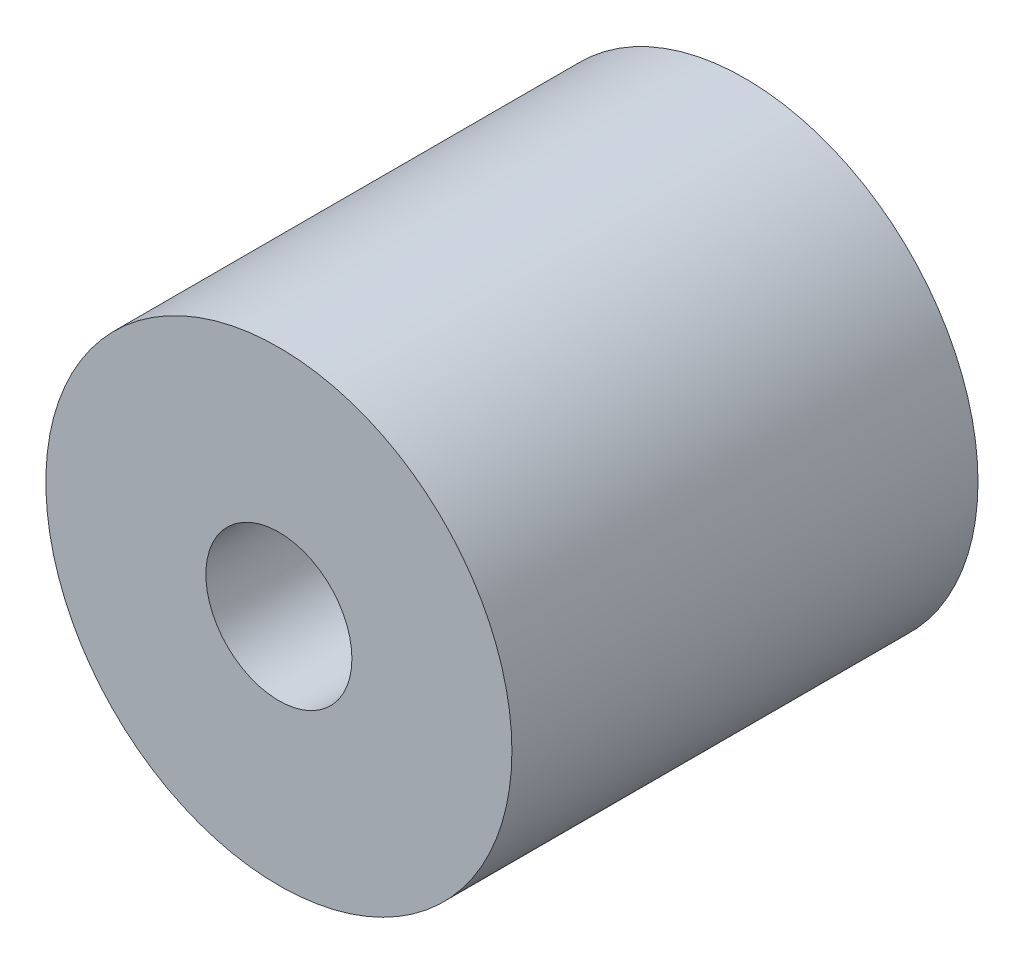
ISO-10303-21;
HEADER;
FILE_DESCRIPTION(('STEP AP214'),'2;1');
FILE_NAME('part.step','',(''),(''),'','','');
FILE_SCHEMA(('AUTOMOTIVE_DESIGN { 1 0 10303 214 1 1 1 1 }'));
ENDSEC;
DATA;
#1=APPLICATION_CONTEXT('core data for automotive mechanical design processes');
#2=APPLICATION_PROTOCOL_DEFINITION('international standard','automotive_design',2000,#1);
#3=PRODUCT_CONTEXT('',#1,'mechanical');
#4=PRODUCT('Part','Part','',(#3));
#5=PRODUCT_RELATED_PRODUCT_CATEGORY('part','',(#4));
#6=PRODUCT_DEFINITION_FORMATION('','',#4);
#7=PRODUCT_DEFINITION_CONTEXT('part definition',#1,'design');
#8=PRODUCT_DEFINITION('design','',#6,#7);
#9=PRODUCT_DEFINITION_SHAPE('','',#8);
#10=(LENGTH_UNIT() NAMED_UNIT(*) SI_UNIT(.MILLI.,.METRE.));
#11=(NAMED_UNIT(*) PLANE_ANGLE_UNIT() SI_UNIT($,.RADIAN.));
#12=(NAMED_UNIT(*) SI_UNIT($,.STERADIAN.) SOLID_ANGLE_UNIT());
#13=UNCERTAINTY_MEASURE_WITH_UNIT(LENGTH_MEASURE(1.E-05),#10,'distance_accuracy_value','');
#14=(GEOMETRIC_REPRESENTATION_CONTEXT(3) GLOBAL_UNCERTAINTY_ASSIGNED_CONTEXT((#13)) GLOBAL_UNIT_ASSIGNED_CONTEXT((#10,
#11,#12)) REPRESENTATION_CONTEXT('',''));
#15=CARTESIAN_POINT('',(0.,0.,0.));
#16=DIRECTION('',(0.,0.,1.));
#17=DIRECTION('',(1.,0.,0.));
#18=AXIS2_PLACEMENT_3D('',#15,#16,#17);
#19=CARTESIAN_POINT('',(0.,0.,15.));
#20=DIRECTION('',(0.,0.,-1.));
#21=DIRECTION('',(-1.,0.,0.));
#22=AXIS2_PLACEMENT_3D('',#19,#20,#21);
#23=CYLINDRICAL_SURFACE('',#22,2.5);
#24=CARTESIAN_POINT('',(0.,0.,6.));
#25=DIRECTION('',(0.,0.,-1.));
#26=DIRECTION('',(-1.,0.,0.));
#27=AXIS2_PLACEMENT_3D('',#24,#25,#26);
#28=CIRCLE('',#27,2.5);
#29=CARTESIAN_POINT('',(2.,-1.5,6.));
#30=VERTEX_POINT('',#29);
#31=CARTESIAN_POINT('',(2.,1.5,6.));
#32=VERTEX_POINT('',#31);
#33=EDGE_CURVE('E152',#30,#32,#28,.F.);
#34=ORIENTED_EDGE('',*,*,#33,.T.);
#35=DIRECTION('',(0.,0.,-1.));
#36=VECTOR('',#35,1.);
#37=CARTESIAN_POINT('',(2.,1.5,6.));
#38=LINE('',#37,#36);
#39=CARTESIAN_POINT('',(2.,1.5,0.));
#40=VERTEX_POINT('',#39);
#41=EDGE_CURVE('E93',#32,#40,#38,.T.);
#42=ORIENTED_EDGE('',*,*,#41,.T.);
#43=CARTESIAN_POINT('',(0.,0.,0.));
#44=DIRECTION('',(0.,0.,1.));
#45=DIRECTION('',(1.,0.,0.));
#46=AXIS2_PLACEMENT_3D('',#43,#44,#45);
#47=CIRCLE('',#46,2.5);
#48=CARTESIAN_POINT('',(2.,-1.5,0.));
#49=VERTEX_POINT('',#48);
#50=EDGE_CURVE('E135',#49,#40,#47,.T.);
#51=ORIENTED_EDGE('',*,*,#50,.F.);
#52=DIRECTION('',(0.,0.,-1.));
#53=VECTOR('',#52,1.);
#54=CARTESIAN_POINT('',(2.,-1.5,6.));
#55=LINE('',#54,#53);
#56=EDGE_CURVE('E129',#30,#49,#55,.T.);
#57=ORIENTED_EDGE('',*,*,#56,.F.);
#58=EDGE_LOOP('',(#34,#42,#51,#57));
#59=FACE_BOUND('',#58,.T.);
#60=ADVANCED_FACE('F35',(#59),#23,.F.);
#61=CARTESIAN_POINT('',(0.,0.,6.));
#62=DIRECTION('',(0.,0.,-1.));
#63=DIRECTION('',(-1.,0.,0.));
#64=AXIS2_PLACEMENT_3D('',#61,#62,#63);
#65=PLANE('',#64);
#66=CARTESIAN_POINT('',(0.,0.,6.));
#67=DIRECTION('',(0.,0.,-1.));
#68=DIRECTION('',(-1.,0.,0.));
#69=AXIS2_PLACEMENT_3D('',#66,#67,#68);
#70=CIRCLE('',#69,2.35);
#71=CARTESIAN_POINT('',(-1.80900525151255,-1.5,6.));
#72=VERTEX_POINT('',#71);
#73=CARTESIAN_POINT('',(1.80900525151255,-1.5,6.));
#74=VERTEX_POINT('',#73);
#75=EDGE_CURVE('E49',#72,#74,#70,.F.);
#76=ORIENTED_EDGE('',*,*,#75,.T.);
#77=DIRECTION('',(1.,0.,0.));
#78=VECTOR('',#77,1.);
#79=CARTESIAN_POINT('',(2.,-1.5,6.));
#80=LINE('',#79,#78);
#81=EDGE_CURVE('E52',#72,#74,#80,.T.);
#82=ORIENTED_EDGE('',*,*,#81,.F.);
#83=EDGE_LOOP('',(#76,#82));
#84=FACE_BOUND('',#83,.T.);
#85=ADVANCED_FACE('F175',(#84),#65,.F.);
#86=CARTESIAN_POINT('',(0.,0.,6.));
#87=DIRECTION('',(0.,0.,-1.));
#88=DIRECTION('',(-1.,0.,0.));
#89=AXIS2_PLACEMENT_3D('',#86,#87,#88);
#90=PLANE('',#89);
#91=CARTESIAN_POINT('',(0.,0.,6.));
#92=DIRECTION('',(0.,0.,-1.));
#93=DIRECTION('',(-1.,0.,0.));
#94=AXIS2_PLACEMENT_3D('',#91,#92,#93);
#95=CIRCLE('',#94,2.35);
#96=CARTESIAN_POINT('',(-1.80900525151255,1.5,6.));
#97=VERTEX_POINT('',#96);
#98=CARTESIAN_POINT('',(1.80900525151255,1.5,6.));
#99=VERTEX_POINT('',#98);
#100=EDGE_CURVE('E11',#97,#99,#95,.T.);
#101=ORIENTED_EDGE('',*,*,#100,.F.);
#102=DIRECTION('',(-1.,0.,0.));
#103=VECTOR('',#102,1.);
#104=CARTESIAN_POINT('',(2.,1.5,6.));
#105=LINE('',#104,#103);
#106=EDGE_CURVE('E90',#99,#97,#105,.T.);
#107=ORIENTED_EDGE('',*,*,#106,.F.);
#108=EDGE_LOOP('',(#101,#107));
#109=FACE_BOUND('',#108,.T.);
#110=ADVANCED_FACE('F100',(#109),#90,.F.);
#111=CARTESIAN_POINT('',(0.,0.,15.));
#112=DIRECTION('',(0.,0.,1.));
#113=DIRECTION('',(1.,0.,0.));
#114=AXIS2_PLACEMENT_3D('',#111,#112,#113);
#115=PLANE('',#114);
#116=CARTESIAN_POINT('',(0.,0.,15.));
#117=DIRECTION('',(0.,0.,1.));
#118=DIRECTION('',(1.,0.,0.));
#119=AXIS2_PLACEMENT_3D('',#116,#117,#118);
#120=CIRCLE('',#119,7.5);
#121=CARTESIAN_POINT('',(7.5,0.,15.));
#122=VERTEX_POINT('',#121);
#123=EDGE_CURVE('E43',#122,#122,#120,.T.);
#124=ORIENTED_EDGE('',*,*,#123,.T.);
#125=EDGE_LOOP('',(#124));
#126=FACE_BOUND('',#125,.T.);
#127=CARTESIAN_POINT('',(0.,0.,15.));
#128=DIRECTION('',(0.,0.,1.));
#129=DIRECTION('',(1.,0.,0.));
#130=AXIS2_PLACEMENT_3D('',#127,#128,#129);
#131=CIRCLE('',#130,2.35);
#132=CARTESIAN_POINT('',(2.35,0.,15.));
#133=VERTEX_POINT('',#132);
#134=EDGE_CURVE('E112',#133,#133,#131,.T.);
#135=ORIENTED_EDGE('',*,*,#134,.F.);
#136=EDGE_LOOP('',(#135));
#137=FACE_BOUND('',#136,.T.);
#138=ADVANCED_FACE('F147',(#126,#137),#115,.T.);
#139=CARTESIAN_POINT('',(0.,0.,0.));
#140=DIRECTION('',(0.,0.,1.));
#141=DIRECTION('',(1.,0.,0.));
#142=AXIS2_PLACEMENT_3D('',#139,#140,#141);
#143=PLANE('',#142);
#144=CARTESIAN_POINT('',(0.,0.,0.));
#145=DIRECTION('',(0.,0.,1.));
#146=DIRECTION('',(1.,0.,0.));
#147=AXIS2_PLACEMENT_3D('',#144,#145,#146);
#148=CIRCLE('',#147,7.5);
#149=CARTESIAN_POINT('',(7.5,0.,0.));
#150=VERTEX_POINT('',#149);
#151=EDGE_CURVE('E138',#150,#150,#148,.T.);
#152=ORIENTED_EDGE('',*,*,#151,.F.);
#153=EDGE_LOOP('',(#152));
#154=FACE_BOUND('',#153,.T.);
#155=ORIENTED_EDGE('',*,*,#50,.T.);
#156=DIRECTION('',(-1.,0.,0.));
#157=VECTOR('',#156,1.);
#158=CARTESIAN_POINT('',(2.,1.5,0.));
#159=LINE('',#158,#157);
#160=CARTESIAN_POINT('',(-2.,1.5,0.));
#161=VERTEX_POINT('',#160);
#162=EDGE_CURVE('E117',#40,#161,#159,.T.);
#163=ORIENTED_EDGE('',*,*,#162,.T.);
#164=CARTESIAN_POINT('',(-2.,-1.5,0.));
#165=VERTEX_POINT('',#164);
#166=EDGE_CURVE('E132',#161,#165,#47,.T.);
#167=ORIENTED_EDGE('',*,*,#166,.T.);
#168=DIRECTION('',(1.,0.,0.));
#169=VECTOR('',#168,1.);
#170=CARTESIAN_POINT('',(2.,-1.5,0.));
#171=LINE('',#170,#169);
#172=EDGE_CURVE('E123',#165,#49,#171,.T.);
#173=ORIENTED_EDGE('',*,*,#172,.T.);
#174=EDGE_LOOP('',(#155,#163,#167,#173));
#175=FACE_BOUND('',#174,.T.);
#176=ADVANCED_FACE('F144',(#154,#175),#143,.F.);
#177=CARTESIAN_POINT('',(0.,0.,15.));
#178=DIRECTION('',(0.,0.,-1.));
#179=DIRECTION('',(-1.,0.,0.));
#180=AXIS2_PLACEMENT_3D('',#177,#178,#179);
#181=CYLINDRICAL_SURFACE('',#180,7.5);
#182=ORIENTED_EDGE('',*,*,#123,.F.);
#183=EDGE_LOOP('',(#182));
#184=FACE_BOUND('',#183,.T.);
#185=ORIENTED_EDGE('',*,*,#151,.T.);
#186=EDGE_LOOP('',(#185));
#187=FACE_BOUND('',#186,.T.);
#188=ADVANCED_FACE('F37',(#184,#187),#181,.T.);
#189=CARTESIAN_POINT('',(-2.,1.5,6.));
#190=VERTEX_POINT('',#189);
#191=CARTESIAN_POINT('',(-2.,-1.5,6.));
#192=VERTEX_POINT('',#191);
#193=EDGE_CURVE('E115',#190,#192,#28,.F.);
#194=ORIENTED_EDGE('',*,*,#193,.T.);
#195=DIRECTION('',(0.,0.,-1.));
#196=VECTOR('',#195,1.);
#197=CARTESIAN_POINT('',(-2.,-1.5,6.));
#198=LINE('',#197,#196);
#199=EDGE_CURVE('E127',#192,#165,#198,.T.);
#200=ORIENTED_EDGE('',*,*,#199,.T.);
#201=ORIENTED_EDGE('',*,*,#166,.F.);
#202=DIRECTION('',(0.,0.,-1.));
#203=VECTOR('',#202,1.);
#204=CARTESIAN_POINT('',(-2.,1.5,6.));
#205=LINE('',#204,#203);
#206=EDGE_CURVE('E120',#190,#161,#205,.T.);
#207=ORIENTED_EDGE('',*,*,#206,.F.);
#208=EDGE_LOOP('',(#194,#200,#201,#207));
#209=FACE_BOUND('',#208,.T.);
#210=ADVANCED_FACE('F158',(#209),#23,.F.);
#211=CARTESIAN_POINT('',(2.,-1.5,6.));
#212=DIRECTION('',(0.,1.,0.));
#213=DIRECTION('',(0.,0.,1.));
#214=AXIS2_PLACEMENT_3D('',#211,#212,#213);
#215=PLANE('',#214);
#216=ORIENTED_EDGE('',*,*,#172,.F.);
#217=ORIENTED_EDGE('',*,*,#199,.F.);
#218=EDGE_CURVE('E125',#192,#72,#80,.T.);
#219=ORIENTED_EDGE('',*,*,#218,.T.);
#220=ORIENTED_EDGE('',*,*,#81,.T.);
#221=DIRECTION('',(-1.,0.,0.));
#222=VECTOR('',#221,1.);
#223=CARTESIAN_POINT('',(2.,-1.5,6.));
#224=LINE('',#223,#222);
#225=EDGE_CURVE('E110',#30,#74,#224,.T.);
#226=ORIENTED_EDGE('',*,*,#225,.F.);
#227=ORIENTED_EDGE('',*,*,#56,.T.);
#228=EDGE_LOOP('',(#216,#217,#219,#220,#226,#227));
#229=FACE_BOUND('',#228,.T.);
#230=ADVANCED_FACE('F163',(#229),#215,.T.);
#231=CARTESIAN_POINT('',(2.,1.5,6.));
#232=DIRECTION('',(0.,-1.,0.));
#233=DIRECTION('',(0.,0.,-1.));
#234=AXIS2_PLACEMENT_3D('',#231,#232,#233);
#235=PLANE('',#234);
#236=ORIENTED_EDGE('',*,*,#162,.F.);
#237=ORIENTED_EDGE('',*,*,#41,.F.);
#238=EDGE_CURVE('E87',#32,#99,#105,.T.);
#239=ORIENTED_EDGE('',*,*,#238,.T.);
#240=ORIENTED_EDGE('',*,*,#106,.T.);
#241=EDGE_CURVE('E98',#97,#190,#105,.T.);
#242=ORIENTED_EDGE('',*,*,#241,.T.);
#243=ORIENTED_EDGE('',*,*,#206,.T.);
#244=EDGE_LOOP('',(#236,#237,#239,#240,#242,#243));
#245=FACE_BOUND('',#244,.T.);
#246=ADVANCED_FACE('F89',(#245),#235,.T.);
#247=CARTESIAN_POINT('',(0.,0.,6.));
#248=DIRECTION('',(0.,0.,-1.));
#249=DIRECTION('',(-1.,0.,0.));
#250=AXIS2_PLACEMENT_3D('',#247,#248,#249);
#251=PLANE('',#250);
#252=ORIENTED_EDGE('',*,*,#33,.F.);
#253=ORIENTED_EDGE('',*,*,#225,.T.);
#254=EDGE_CURVE('E105',#74,#99,#70,.F.);
#255=ORIENTED_EDGE('',*,*,#254,.T.);
#256=ORIENTED_EDGE('',*,*,#238,.F.);
#257=EDGE_LOOP('',(#252,#253,#255,#256));
#258=FACE_BOUND('',#257,.T.);
#259=ADVANCED_FACE('F109',(#258),#251,.T.);
#260=CARTESIAN_POINT('',(0.,0.,-1.07106781186548));
#261=DIRECTION('',(0.,0.,1.));
#262=DIRECTION('',(1.,0.,0.));
#263=AXIS2_PLACEMENT_3D('',#260,#261,#262);
#264=CYLINDRICAL_SURFACE('',#263,2.35);
#265=ORIENTED_EDGE('',*,*,#134,.T.);
#266=EDGE_LOOP('',(#265));
#267=FACE_BOUND('',#266,.T.);
#268=ORIENTED_EDGE('',*,*,#75,.F.);
#269=EDGE_CURVE('E107',#97,#72,#70,.F.);
#270=ORIENTED_EDGE('',*,*,#269,.F.);
#271=ORIENTED_EDGE('',*,*,#100,.T.);
#272=ORIENTED_EDGE('',*,*,#254,.F.);
#273=EDGE_LOOP('',(#268,#270,#271,#272));
#274=FACE_BOUND('',#273,.T.);
#275=ADVANCED_FACE('F104',(#267,#274),#264,.F.);
#276=ORIENTED_EDGE('',*,*,#269,.T.);
#277=ORIENTED_EDGE('',*,*,#218,.F.);
#278=ORIENTED_EDGE('',*,*,#193,.F.);
#279=ORIENTED_EDGE('',*,*,#241,.F.);
#280=EDGE_LOOP('',(#276,#277,#278,#279));
#281=FACE_BOUND('',#280,.T.);
#282=ADVANCED_FACE('F164',(#281),#251,.T.);
#283=CLOSED_SHELL('',(#60,#85,#110,#138,#176,#188,#210,#230,#246,#259,#275,#282));
#284=MANIFOLD_SOLID_BREP('B2',#283);
#285=ADVANCED_BREP_SHAPE_REPRESENTATION('',(#18,#284),#14);
#286=SHAPE_DEFINITION_REPRESENTATION(#9,#285);
ENDSEC;
END-ISO-10303-21;
